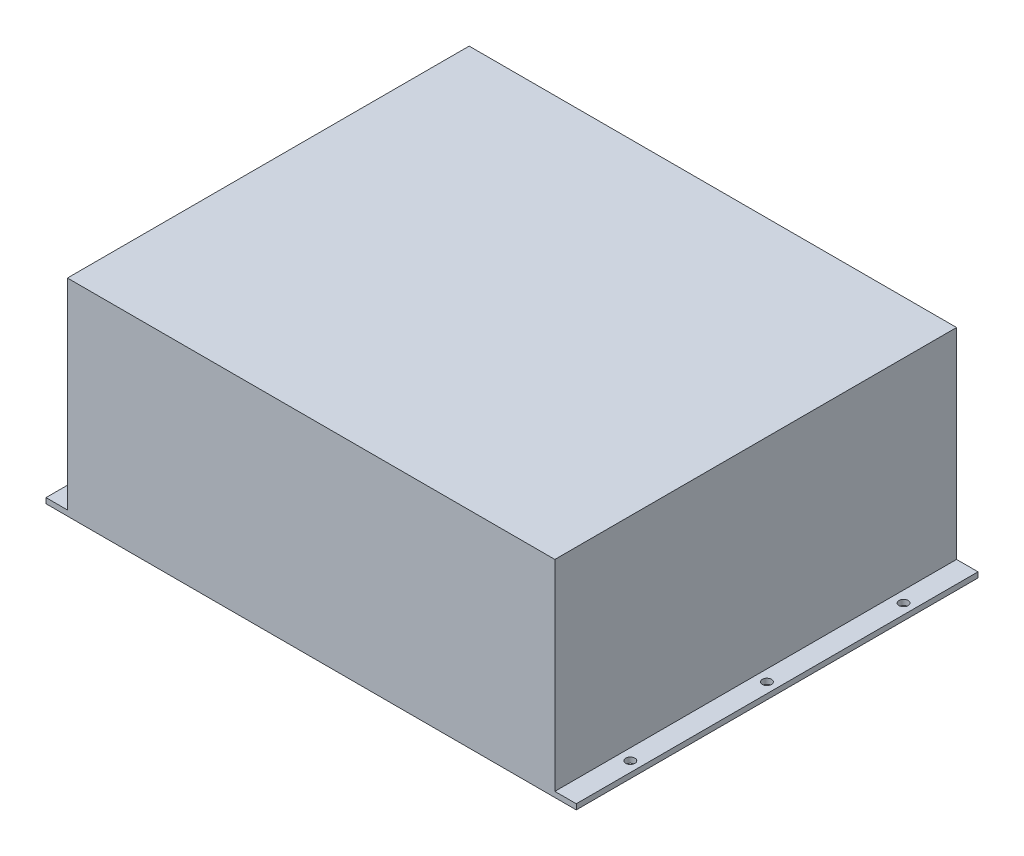
ISO-10303-21;
HEADER;
FILE_DESCRIPTION(('STEP AP214'),'2;1');
FILE_NAME('part.step','',(''),(''),'','','');
FILE_SCHEMA(('AUTOMOTIVE_DESIGN { 1 0 10303 214 1 1 1 1 }'));
ENDSEC;
DATA;
#1=APPLICATION_CONTEXT('core data for automotive mechanical design processes');
#2=APPLICATION_PROTOCOL_DEFINITION('international standard','automotive_design',2000,#1);
#3=PRODUCT_CONTEXT('',#1,'mechanical');
#4=PRODUCT('Part','Part','',(#3));
#5=PRODUCT_RELATED_PRODUCT_CATEGORY('part','',(#4));
#6=PRODUCT_DEFINITION_FORMATION('','',#4);
#7=PRODUCT_DEFINITION_CONTEXT('part definition',#1,'design');
#8=PRODUCT_DEFINITION('design','',#6,#7);
#9=PRODUCT_DEFINITION_SHAPE('','',#8);
#10=(LENGTH_UNIT() NAMED_UNIT(*) SI_UNIT(.MILLI.,.METRE.));
#11=(NAMED_UNIT(*) PLANE_ANGLE_UNIT() SI_UNIT($,.RADIAN.));
#12=(NAMED_UNIT(*) SI_UNIT($,.STERADIAN.) SOLID_ANGLE_UNIT());
#13=UNCERTAINTY_MEASURE_WITH_UNIT(LENGTH_MEASURE(1.E-05),#10,'distance_accuracy_value','');
#14=(GEOMETRIC_REPRESENTATION_CONTEXT(3) GLOBAL_UNCERTAINTY_ASSIGNED_CONTEXT((#13)) GLOBAL_UNIT_ASSIGNED_CONTEXT((#10,
#11,#12)) REPRESENTATION_CONTEXT('',''));
#15=CARTESIAN_POINT('',(0.,0.,0.));
#16=DIRECTION('',(0.,0.,1.));
#17=DIRECTION('',(1.,0.,0.));
#18=AXIS2_PLACEMENT_3D('',#15,#16,#17);
#19=CARTESIAN_POINT('',(91.,77.,75.));
#20=DIRECTION('',(-1.,0.,0.));
#21=DIRECTION('',(0.,0.,1.));
#22=AXIS2_PLACEMENT_3D('',#19,#20,#21);
#23=PLANE('',#22);
#24=DIRECTION('',(0.,0.,1.));
#25=VECTOR('',#24,1.);
#26=CARTESIAN_POINT('',(91.,2.,75.));
#27=LINE('',#26,#25);
#28=CARTESIAN_POINT('',(91.,2.,-75.));
#29=VERTEX_POINT('',#28);
#30=CARTESIAN_POINT('',(91.,2.,75.));
#31=VERTEX_POINT('',#30);
#32=EDGE_CURVE('E49',#29,#31,#27,.T.);
#33=ORIENTED_EDGE('',*,*,#32,.F.);
#34=DIRECTION('',(0.,-1.,0.));
#35=VECTOR('',#34,1.);
#36=CARTESIAN_POINT('',(91.,77.,-75.));
#37=LINE('',#36,#35);
#38=CARTESIAN_POINT('',(91.,77.,-75.));
#39=VERTEX_POINT('',#38);
#40=EDGE_CURVE('E122',#39,#29,#37,.T.);
#41=ORIENTED_EDGE('',*,*,#40,.F.);
#42=DIRECTION('',(0.,0.,-1.));
#43=VECTOR('',#42,1.);
#44=CARTESIAN_POINT('',(91.,77.,75.));
#45=LINE('',#44,#43);
#46=CARTESIAN_POINT('',(91.,77.,75.));
#47=VERTEX_POINT('',#46);
#48=EDGE_CURVE('E168',#47,#39,#45,.T.);
#49=ORIENTED_EDGE('',*,*,#48,.F.);
#50=DIRECTION('',(0.,-1.,0.));
#51=VECTOR('',#50,1.);
#52=CARTESIAN_POINT('',(91.,77.,75.));
#53=LINE('',#52,#51);
#54=EDGE_CURVE('E178',#47,#31,#53,.T.);
#55=ORIENTED_EDGE('',*,*,#54,.T.);
#56=EDGE_LOOP('',(#33,#41,#49,#55));
#57=FACE_BOUND('',#56,.T.);
#58=ADVANCED_FACE('F35',(#57),#23,.F.);
#59=CARTESIAN_POINT('',(-91.,77.,-75.));
#60=DIRECTION('',(0.,0.,1.));
#61=DIRECTION('',(1.,0.,0.));
#62=AXIS2_PLACEMENT_3D('',#59,#60,#61);
#63=PLANE('',#62);
#64=DIRECTION('',(-1.,0.,0.));
#65=VECTOR('',#64,1.);
#66=CARTESIAN_POINT('',(-91.,0.,-75.));
#67=LINE('',#66,#65);
#68=CARTESIAN_POINT('',(99.,0.,-75.));
#69=VERTEX_POINT('',#68);
#70=CARTESIAN_POINT('',(-99.,0.,-75.));
#71=VERTEX_POINT('',#70);
#72=EDGE_CURVE('E165',#69,#71,#67,.T.);
#73=ORIENTED_EDGE('',*,*,#72,.T.);
#74=DIRECTION('',(0.,-1.,0.));
#75=VECTOR('',#74,1.);
#76=CARTESIAN_POINT('',(-99.,2.,-75.));
#77=LINE('',#76,#75);
#78=CARTESIAN_POINT('',(-99.,2.,-75.));
#79=VERTEX_POINT('',#78);
#80=EDGE_CURVE('E162',#79,#71,#77,.T.);
#81=ORIENTED_EDGE('',*,*,#80,.F.);
#82=DIRECTION('',(1.,0.,0.));
#83=VECTOR('',#82,1.);
#84=CARTESIAN_POINT('',(-91.,2.,-75.));
#85=LINE('',#84,#83);
#86=CARTESIAN_POINT('',(-91.,2.,-75.));
#87=VERTEX_POINT('',#86);
#88=EDGE_CURVE('E156',#79,#87,#85,.T.);
#89=ORIENTED_EDGE('',*,*,#88,.T.);
#90=DIRECTION('',(0.,-1.,0.));
#91=VECTOR('',#90,1.);
#92=CARTESIAN_POINT('',(-91.,77.,-75.));
#93=LINE('',#92,#91);
#94=CARTESIAN_POINT('',(-91.,77.,-75.));
#95=VERTEX_POINT('',#94);
#96=EDGE_CURVE('E185',#95,#87,#93,.T.);
#97=ORIENTED_EDGE('',*,*,#96,.F.);
#98=DIRECTION('',(-1.,0.,0.));
#99=VECTOR('',#98,1.);
#100=CARTESIAN_POINT('',(-91.,77.,-75.));
#101=LINE('',#100,#99);
#102=EDGE_CURVE('E171',#39,#95,#101,.T.);
#103=ORIENTED_EDGE('',*,*,#102,.F.);
#104=ORIENTED_EDGE('',*,*,#40,.T.);
#105=DIRECTION('',(-1.,0.,0.));
#106=VECTOR('',#105,1.);
#107=CARTESIAN_POINT('',(91.,2.,-75.));
#108=LINE('',#107,#106);
#109=CARTESIAN_POINT('',(99.,2.,-75.));
#110=VERTEX_POINT('',#109);
#111=EDGE_CURVE('E105',#110,#29,#108,.T.);
#112=ORIENTED_EDGE('',*,*,#111,.F.);
#113=DIRECTION('',(0.,-1.,0.));
#114=VECTOR('',#113,1.);
#115=CARTESIAN_POINT('',(99.,2.,-75.));
#116=LINE('',#115,#114);
#117=EDGE_CURVE('E114',#110,#69,#116,.T.);
#118=ORIENTED_EDGE('',*,*,#117,.T.);
#119=EDGE_LOOP('',(#73,#81,#89,#97,#103,#104,#112,#118));
#120=FACE_BOUND('',#119,.T.);
#121=ADVANCED_FACE('F121',(#120),#63,.F.);
#122=CARTESIAN_POINT('',(-91.,77.,75.));
#123=DIRECTION('',(1.,0.,0.));
#124=DIRECTION('',(0.,0.,-1.));
#125=AXIS2_PLACEMENT_3D('',#122,#123,#124);
#126=PLANE('',#125);
#127=CARTESIAN_POINT('',(-91.,39.5,-10.));
#128=DIRECTION('',(1.,0.,0.));
#129=DIRECTION('',(0.,0.,-1.));
#130=AXIS2_PLACEMENT_3D('',#127,#128,#129);
#131=CIRCLE('',#130,4.00000000000001);
#132=CARTESIAN_POINT('',(-91.,39.5,-14.));
#133=VERTEX_POINT('',#132);
#134=EDGE_CURVE('E11',#133,#133,#131,.F.);
#135=ORIENTED_EDGE('',*,*,#134,.F.);
#136=EDGE_LOOP('',(#135));
#137=FACE_BOUND('',#136,.T.);
#138=CARTESIAN_POINT('',(-91.,39.5,10.));
#139=DIRECTION('',(1.,0.,0.));
#140=DIRECTION('',(0.,0.,-1.));
#141=AXIS2_PLACEMENT_3D('',#138,#139,#140);
#142=CIRCLE('',#141,4.00000000000001);
#143=CARTESIAN_POINT('',(-91.,39.5,5.99999999999999));
#144=VERTEX_POINT('',#143);
#145=EDGE_CURVE('E42',#144,#144,#142,.F.);
#146=ORIENTED_EDGE('',*,*,#145,.F.);
#147=EDGE_LOOP('',(#146));
#148=FACE_BOUND('',#147,.T.);
#149=CARTESIAN_POINT('',(-91.,39.5,0.));
#150=DIRECTION('',(1.,0.,0.));
#151=DIRECTION('',(0.,0.,-1.));
#152=AXIS2_PLACEMENT_3D('',#149,#150,#151);
#153=CIRCLE('',#152,4.);
#154=CARTESIAN_POINT('',(-91.,39.5,-4.));
#155=VERTEX_POINT('',#154);
#156=EDGE_CURVE('E189',#155,#155,#153,.F.);
#157=ORIENTED_EDGE('',*,*,#156,.F.);
#158=EDGE_LOOP('',(#157));
#159=FACE_BOUND('',#158,.T.);
#160=ORIENTED_EDGE('',*,*,#96,.T.);
#161=DIRECTION('',(0.,0.,1.));
#162=VECTOR('',#161,1.);
#163=CARTESIAN_POINT('',(-91.,2.,75.));
#164=LINE('',#163,#162);
#165=CARTESIAN_POINT('',(-91.,2.,75.));
#166=VERTEX_POINT('',#165);
#167=EDGE_CURVE('E150',#87,#166,#164,.T.);
#168=ORIENTED_EDGE('',*,*,#167,.T.);
#169=DIRECTION('',(0.,-1.,0.));
#170=VECTOR('',#169,1.);
#171=CARTESIAN_POINT('',(-91.,77.,75.));
#172=LINE('',#171,#170);
#173=CARTESIAN_POINT('',(-91.,77.,75.));
#174=VERTEX_POINT('',#173);
#175=EDGE_CURVE('E182',#174,#166,#172,.T.);
#176=ORIENTED_EDGE('',*,*,#175,.F.);
#177=DIRECTION('',(0.,0.,1.));
#178=VECTOR('',#177,1.);
#179=CARTESIAN_POINT('',(-91.,77.,75.));
#180=LINE('',#179,#178);
#181=EDGE_CURVE('E174',#95,#174,#180,.T.);
#182=ORIENTED_EDGE('',*,*,#181,.F.);
#183=EDGE_LOOP('',(#160,#168,#176,#182));
#184=FACE_BOUND('',#183,.T.);
#185=ADVANCED_FACE('F196',(#137,#148,#159,#184),#126,.F.);
#186=CARTESIAN_POINT('',(-91.,77.,75.));
#187=DIRECTION('',(0.,0.,-1.));
#188=DIRECTION('',(-1.,0.,0.));
#189=AXIS2_PLACEMENT_3D('',#186,#187,#188);
#190=PLANE('',#189);
#191=DIRECTION('',(1.,0.,0.));
#192=VECTOR('',#191,1.);
#193=CARTESIAN_POINT('',(-91.,0.,75.));
#194=LINE('',#193,#192);
#195=CARTESIAN_POINT('',(-99.,0.,75.));
#196=VERTEX_POINT('',#195);
#197=CARTESIAN_POINT('',(99.,0.,75.));
#198=VERTEX_POINT('',#197);
#199=EDGE_CURVE('E172',#196,#198,#194,.T.);
#200=ORIENTED_EDGE('',*,*,#199,.T.);
#201=DIRECTION('',(0.,-1.,0.));
#202=VECTOR('',#201,1.);
#203=CARTESIAN_POINT('',(99.,2.,75.));
#204=LINE('',#203,#202);
#205=CARTESIAN_POINT('',(99.,2.,75.));
#206=VERTEX_POINT('',#205);
#207=EDGE_CURVE('E119',#206,#198,#204,.T.);
#208=ORIENTED_EDGE('',*,*,#207,.F.);
#209=DIRECTION('',(1.,0.,0.));
#210=VECTOR('',#209,1.);
#211=CARTESIAN_POINT('',(91.,2.,75.));
#212=LINE('',#211,#210);
#213=EDGE_CURVE('E107',#31,#206,#212,.T.);
#214=ORIENTED_EDGE('',*,*,#213,.F.);
#215=ORIENTED_EDGE('',*,*,#54,.F.);
#216=DIRECTION('',(1.,0.,0.));
#217=VECTOR('',#216,1.);
#218=CARTESIAN_POINT('',(-91.,77.,75.));
#219=LINE('',#218,#217);
#220=EDGE_CURVE('E176',#174,#47,#219,.T.);
#221=ORIENTED_EDGE('',*,*,#220,.F.);
#222=ORIENTED_EDGE('',*,*,#175,.T.);
#223=DIRECTION('',(-1.,0.,0.));
#224=VECTOR('',#223,1.);
#225=CARTESIAN_POINT('',(-91.,2.,75.));
#226=LINE('',#225,#224);
#227=CARTESIAN_POINT('',(-99.,2.,75.));
#228=VERTEX_POINT('',#227);
#229=EDGE_CURVE('E57',#166,#228,#226,.T.);
#230=ORIENTED_EDGE('',*,*,#229,.T.);
#231=DIRECTION('',(0.,-1.,0.));
#232=VECTOR('',#231,1.);
#233=CARTESIAN_POINT('',(-99.,2.,75.));
#234=LINE('',#233,#232);
#235=EDGE_CURVE('E159',#228,#196,#234,.T.);
#236=ORIENTED_EDGE('',*,*,#235,.T.);
#237=EDGE_LOOP('',(#200,#208,#214,#215,#221,#222,#230,#236));
#238=FACE_BOUND('',#237,.T.);
#239=ADVANCED_FACE('F199',(#238),#190,.F.);
#240=CARTESIAN_POINT('',(0.,77.,0.));
#241=DIRECTION('',(0.,-1.,0.));
#242=DIRECTION('',(0.,0.,-1.));
#243=AXIS2_PLACEMENT_3D('',#240,#241,#242);
#244=PLANE('',#243);
#245=ORIENTED_EDGE('',*,*,#48,.T.);
#246=ORIENTED_EDGE('',*,*,#102,.T.);
#247=ORIENTED_EDGE('',*,*,#181,.T.);
#248=ORIENTED_EDGE('',*,*,#220,.T.);
#249=EDGE_LOOP('',(#245,#246,#247,#248));
#250=FACE_BOUND('',#249,.T.);
#251=ADVANCED_FACE('F216',(#250),#244,.F.);
#252=CARTESIAN_POINT('',(0.,0.,0.));
#253=DIRECTION('',(0.,-1.,0.));
#254=DIRECTION('',(0.,0.,-1.));
#255=AXIS2_PLACEMENT_3D('',#252,#253,#254);
#256=PLANE('',#255);
#257=CARTESIAN_POINT('',(95.2,0.,-51.));
#258=DIRECTION('',(0.,-1.,0.));
#259=DIRECTION('',(0.,0.,1.));
#260=AXIS2_PLACEMENT_3D('',#257,#258,#259);
#261=CIRCLE('',#260,1.7);
#262=CARTESIAN_POINT('',(95.2,0.,-49.3));
#263=VERTEX_POINT('',#262);
#264=EDGE_CURVE('E129',#263,#263,#261,.T.);
#265=ORIENTED_EDGE('',*,*,#264,.F.);
#266=EDGE_LOOP('',(#265));
#267=FACE_BOUND('',#266,.T.);
#268=CARTESIAN_POINT('',(95.2,0.,51.));
#269=DIRECTION('',(0.,-1.,0.));
#270=DIRECTION('',(0.,0.,-1.));
#271=AXIS2_PLACEMENT_3D('',#268,#269,#270);
#272=CIRCLE('',#271,1.7);
#273=CARTESIAN_POINT('',(95.2,0.,49.3));
#274=VERTEX_POINT('',#273);
#275=EDGE_CURVE('E308',#274,#274,#272,.T.);
#276=ORIENTED_EDGE('',*,*,#275,.F.);
#277=EDGE_LOOP('',(#276));
#278=FACE_BOUND('',#277,.T.);
#279=CARTESIAN_POINT('',(95.2,0.,0.));
#280=DIRECTION('',(0.,-1.,0.));
#281=DIRECTION('',(0.,0.,1.));
#282=AXIS2_PLACEMENT_3D('',#279,#280,#281);
#283=CIRCLE('',#282,1.7);
#284=CARTESIAN_POINT('',(95.2,0.,1.7));
#285=VERTEX_POINT('',#284);
#286=EDGE_CURVE('E314',#285,#285,#283,.T.);
#287=ORIENTED_EDGE('',*,*,#286,.F.);
#288=EDGE_LOOP('',(#287));
#289=FACE_BOUND('',#288,.T.);
#290=CARTESIAN_POINT('',(-95.2,0.,-51.));
#291=DIRECTION('',(0.,1.,0.));
#292=DIRECTION('',(0.,0.,1.));
#293=AXIS2_PLACEMENT_3D('',#290,#291,#292);
#294=CIRCLE('',#293,1.7);
#295=CARTESIAN_POINT('',(-95.2,0.,-49.3));
#296=VERTEX_POINT('',#295);
#297=EDGE_CURVE('E132',#296,#296,#294,.T.);
#298=ORIENTED_EDGE('',*,*,#297,.T.);
#299=EDGE_LOOP('',(#298));
#300=FACE_BOUND('',#299,.T.);
#301=CARTESIAN_POINT('',(-95.2,0.,51.));
#302=DIRECTION('',(0.,1.,0.));
#303=DIRECTION('',(0.,0.,-1.));
#304=AXIS2_PLACEMENT_3D('',#301,#302,#303);
#305=CIRCLE('',#304,1.7);
#306=CARTESIAN_POINT('',(-95.2,0.,49.3));
#307=VERTEX_POINT('',#306);
#308=EDGE_CURVE('E139',#307,#307,#305,.T.);
#309=ORIENTED_EDGE('',*,*,#308,.T.);
#310=EDGE_LOOP('',(#309));
#311=FACE_BOUND('',#310,.T.);
#312=CARTESIAN_POINT('',(-95.2,0.,0.));
#313=DIRECTION('',(0.,1.,0.));
#314=DIRECTION('',(0.,0.,1.));
#315=AXIS2_PLACEMENT_3D('',#312,#313,#314);
#316=CIRCLE('',#315,1.7);
#317=CARTESIAN_POINT('',(-95.2,0.,1.7));
#318=VERTEX_POINT('',#317);
#319=EDGE_CURVE('E145',#318,#318,#316,.T.);
#320=ORIENTED_EDGE('',*,*,#319,.T.);
#321=EDGE_LOOP('',(#320));
#322=FACE_BOUND('',#321,.T.);
#323=ORIENTED_EDGE('',*,*,#72,.F.);
#324=DIRECTION('',(0.,0.,-1.));
#325=VECTOR('',#324,1.);
#326=CARTESIAN_POINT('',(99.,0.,75.));
#327=LINE('',#326,#325);
#328=EDGE_CURVE('E117',#198,#69,#327,.T.);
#329=ORIENTED_EDGE('',*,*,#328,.F.);
#330=ORIENTED_EDGE('',*,*,#199,.F.);
#331=DIRECTION('',(0.,0.,-1.));
#332=VECTOR('',#331,1.);
#333=CARTESIAN_POINT('',(-99.,0.,75.));
#334=LINE('',#333,#332);
#335=EDGE_CURVE('E135',#196,#71,#334,.T.);
#336=ORIENTED_EDGE('',*,*,#335,.T.);
#337=EDGE_LOOP('',(#323,#329,#330,#336));
#338=FACE_BOUND('',#337,.T.);
#339=ADVANCED_FACE('F226',(#267,#278,#289,#300,#311,#322,#338),#256,.T.);
#340=CARTESIAN_POINT('',(-99.,2.,75.));
#341=DIRECTION('',(-1.,0.,0.));
#342=DIRECTION('',(0.,0.,1.));
#343=AXIS2_PLACEMENT_3D('',#340,#341,#342);
#344=PLANE('',#343);
#345=ORIENTED_EDGE('',*,*,#335,.F.);
#346=ORIENTED_EDGE('',*,*,#235,.F.);
#347=DIRECTION('',(0.,0.,-1.));
#348=VECTOR('',#347,1.);
#349=CARTESIAN_POINT('',(-99.,2.,75.));
#350=LINE('',#349,#348);
#351=EDGE_CURVE('E153',#228,#79,#350,.T.);
#352=ORIENTED_EDGE('',*,*,#351,.T.);
#353=ORIENTED_EDGE('',*,*,#80,.T.);
#354=EDGE_LOOP('',(#345,#346,#352,#353));
#355=FACE_BOUND('',#354,.T.);
#356=ADVANCED_FACE('F229',(#355),#344,.T.);
#357=CARTESIAN_POINT('',(0.,2.,0.));
#358=DIRECTION('',(0.,1.,0.));
#359=DIRECTION('',(0.,0.,1.));
#360=AXIS2_PLACEMENT_3D('',#357,#358,#359);
#361=PLANE('',#360);
#362=CARTESIAN_POINT('',(-95.2,2.,-51.));
#363=DIRECTION('',(0.,1.,0.));
#364=DIRECTION('',(0.,0.,1.));
#365=AXIS2_PLACEMENT_3D('',#362,#363,#364);
#366=CIRCLE('',#365,1.7);
#367=CARTESIAN_POINT('',(-95.2,2.,-49.3));
#368=VERTEX_POINT('',#367);
#369=EDGE_CURVE('E136',#368,#368,#366,.T.);
#370=ORIENTED_EDGE('',*,*,#369,.F.);
#371=EDGE_LOOP('',(#370));
#372=FACE_BOUND('',#371,.T.);
#373=CARTESIAN_POINT('',(-95.2,2.,51.));
#374=DIRECTION('',(0.,1.,0.));
#375=DIRECTION('',(0.,0.,-1.));
#376=AXIS2_PLACEMENT_3D('',#373,#374,#375);
#377=CIRCLE('',#376,1.7);
#378=CARTESIAN_POINT('',(-95.2,2.,49.3));
#379=VERTEX_POINT('',#378);
#380=EDGE_CURVE('E142',#379,#379,#377,.T.);
#381=ORIENTED_EDGE('',*,*,#380,.F.);
#382=EDGE_LOOP('',(#381));
#383=FACE_BOUND('',#382,.T.);
#384=CARTESIAN_POINT('',(-95.2,2.,0.));
#385=DIRECTION('',(0.,1.,0.));
#386=DIRECTION('',(0.,0.,1.));
#387=AXIS2_PLACEMENT_3D('',#384,#385,#386);
#388=CIRCLE('',#387,1.7);
#389=CARTESIAN_POINT('',(-95.2,2.,1.7));
#390=VERTEX_POINT('',#389);
#391=EDGE_CURVE('E130',#390,#390,#388,.T.);
#392=ORIENTED_EDGE('',*,*,#391,.F.);
#393=EDGE_LOOP('',(#392));
#394=FACE_BOUND('',#393,.T.);
#395=ORIENTED_EDGE('',*,*,#167,.F.);
#396=ORIENTED_EDGE('',*,*,#88,.F.);
#397=ORIENTED_EDGE('',*,*,#351,.F.);
#398=ORIENTED_EDGE('',*,*,#229,.F.);
#399=EDGE_LOOP('',(#395,#396,#397,#398));
#400=FACE_BOUND('',#399,.T.);
#401=ADVANCED_FACE('F208',(#372,#383,#394,#400),#361,.T.);
#402=CARTESIAN_POINT('',(-95.2,0.,0.));
#403=DIRECTION('',(0.,1.,0.));
#404=DIRECTION('',(0.,0.,1.));
#405=AXIS2_PLACEMENT_3D('',#402,#403,#404);
#406=CYLINDRICAL_SURFACE('',#405,1.7);
#407=ORIENTED_EDGE('',*,*,#319,.F.);
#408=EDGE_LOOP('',(#407));
#409=FACE_BOUND('',#408,.T.);
#410=ORIENTED_EDGE('',*,*,#391,.T.);
#411=EDGE_LOOP('',(#410));
#412=FACE_BOUND('',#411,.T.);
#413=ADVANCED_FACE('F237',(#409,#412),#406,.F.);
#414=CARTESIAN_POINT('',(-95.2,0.,51.));
#415=DIRECTION('',(0.,1.,0.));
#416=DIRECTION('',(0.,0.,1.));
#417=AXIS2_PLACEMENT_3D('',#414,#415,#416);
#418=CYLINDRICAL_SURFACE('',#417,1.7);
#419=ORIENTED_EDGE('',*,*,#308,.F.);
#420=EDGE_LOOP('',(#419));
#421=FACE_BOUND('',#420,.T.);
#422=ORIENTED_EDGE('',*,*,#380,.T.);
#423=EDGE_LOOP('',(#422));
#424=FACE_BOUND('',#423,.T.);
#425=ADVANCED_FACE('F241',(#421,#424),#418,.F.);
#426=CARTESIAN_POINT('',(-95.2,0.,-51.));
#427=DIRECTION('',(0.,1.,0.));
#428=DIRECTION('',(0.,0.,1.));
#429=AXIS2_PLACEMENT_3D('',#426,#427,#428);
#430=CYLINDRICAL_SURFACE('',#429,1.7);
#431=ORIENTED_EDGE('',*,*,#297,.F.);
#432=EDGE_LOOP('',(#431));
#433=FACE_BOUND('',#432,.T.);
#434=ORIENTED_EDGE('',*,*,#369,.T.);
#435=EDGE_LOOP('',(#434));
#436=FACE_BOUND('',#435,.T.);
#437=ADVANCED_FACE('F245',(#433,#436),#430,.F.);
#438=CARTESIAN_POINT('',(99.,2.,75.));
#439=DIRECTION('',(-1.,0.,0.));
#440=DIRECTION('',(0.,0.,1.));
#441=AXIS2_PLACEMENT_3D('',#438,#439,#440);
#442=PLANE('',#441);
#443=ORIENTED_EDGE('',*,*,#328,.T.);
#444=ORIENTED_EDGE('',*,*,#117,.F.);
#445=DIRECTION('',(0.,0.,-1.));
#446=VECTOR('',#445,1.);
#447=CARTESIAN_POINT('',(99.,2.,75.));
#448=LINE('',#447,#446);
#449=EDGE_CURVE('E101',#206,#110,#448,.T.);
#450=ORIENTED_EDGE('',*,*,#449,.F.);
#451=ORIENTED_EDGE('',*,*,#207,.T.);
#452=EDGE_LOOP('',(#443,#444,#450,#451));
#453=FACE_BOUND('',#452,.T.);
#454=ADVANCED_FACE('F115',(#453),#442,.F.);
#455=CARTESIAN_POINT('',(0.,2.,0.));
#456=DIRECTION('',(0.,1.,0.));
#457=DIRECTION('',(0.,0.,1.));
#458=AXIS2_PLACEMENT_3D('',#455,#456,#457);
#459=PLANE('',#458);
#460=CARTESIAN_POINT('',(95.2,2.,-51.));
#461=DIRECTION('',(0.,-1.,0.));
#462=DIRECTION('',(0.,0.,1.));
#463=AXIS2_PLACEMENT_3D('',#460,#461,#462);
#464=CIRCLE('',#463,1.7);
#465=CARTESIAN_POINT('',(95.2,2.,-49.3));
#466=VERTEX_POINT('',#465);
#467=EDGE_CURVE('E305',#466,#466,#464,.T.);
#468=ORIENTED_EDGE('',*,*,#467,.T.);
#469=EDGE_LOOP('',(#468));
#470=FACE_BOUND('',#469,.T.);
#471=CARTESIAN_POINT('',(95.2,2.,51.));
#472=DIRECTION('',(0.,-1.,0.));
#473=DIRECTION('',(0.,0.,-1.));
#474=AXIS2_PLACEMENT_3D('',#471,#472,#473);
#475=CIRCLE('',#474,1.7);
#476=CARTESIAN_POINT('',(95.2,2.,49.3));
#477=VERTEX_POINT('',#476);
#478=EDGE_CURVE('E311',#477,#477,#475,.T.);
#479=ORIENTED_EDGE('',*,*,#478,.T.);
#480=EDGE_LOOP('',(#479));
#481=FACE_BOUND('',#480,.T.);
#482=CARTESIAN_POINT('',(95.2,2.,0.));
#483=DIRECTION('',(0.,-1.,0.));
#484=DIRECTION('',(0.,0.,1.));
#485=AXIS2_PLACEMENT_3D('',#482,#483,#484);
#486=CIRCLE('',#485,1.7);
#487=CARTESIAN_POINT('',(95.2,2.,1.7));
#488=VERTEX_POINT('',#487);
#489=EDGE_CURVE('E302',#488,#488,#486,.T.);
#490=ORIENTED_EDGE('',*,*,#489,.T.);
#491=EDGE_LOOP('',(#490));
#492=FACE_BOUND('',#491,.T.);
#493=ORIENTED_EDGE('',*,*,#32,.T.);
#494=ORIENTED_EDGE('',*,*,#213,.T.);
#495=ORIENTED_EDGE('',*,*,#449,.T.);
#496=ORIENTED_EDGE('',*,*,#111,.T.);
#497=EDGE_LOOP('',(#493,#494,#495,#496));
#498=FACE_BOUND('',#497,.T.);
#499=ADVANCED_FACE('F103',(#470,#481,#492,#498),#459,.T.);
#500=CARTESIAN_POINT('',(95.2,0.,0.));
#501=DIRECTION('',(0.,1.,0.));
#502=DIRECTION('',(0.,0.,1.));
#503=AXIS2_PLACEMENT_3D('',#500,#501,#502);
#504=CYLINDRICAL_SURFACE('',#503,1.7);
#505=ORIENTED_EDGE('',*,*,#286,.T.);
#506=EDGE_LOOP('',(#505));
#507=FACE_BOUND('',#506,.T.);
#508=ORIENTED_EDGE('',*,*,#489,.F.);
#509=EDGE_LOOP('',(#508));
#510=FACE_BOUND('',#509,.T.);
#511=ADVANCED_FACE('F254',(#507,#510),#504,.F.);
#512=CARTESIAN_POINT('',(95.2,0.,51.));
#513=DIRECTION('',(0.,1.,0.));
#514=DIRECTION('',(0.,0.,1.));
#515=AXIS2_PLACEMENT_3D('',#512,#513,#514);
#516=CYLINDRICAL_SURFACE('',#515,1.7);
#517=ORIENTED_EDGE('',*,*,#275,.T.);
#518=EDGE_LOOP('',(#517));
#519=FACE_BOUND('',#518,.T.);
#520=ORIENTED_EDGE('',*,*,#478,.F.);
#521=EDGE_LOOP('',(#520));
#522=FACE_BOUND('',#521,.T.);
#523=ADVANCED_FACE('F258',(#519,#522),#516,.F.);
#524=CARTESIAN_POINT('',(95.2,0.,-51.));
#525=DIRECTION('',(0.,1.,0.));
#526=DIRECTION('',(0.,0.,1.));
#527=AXIS2_PLACEMENT_3D('',#524,#525,#526);
#528=CYLINDRICAL_SURFACE('',#527,1.7);
#529=ORIENTED_EDGE('',*,*,#264,.T.);
#530=EDGE_LOOP('',(#529));
#531=FACE_BOUND('',#530,.T.);
#532=ORIENTED_EDGE('',*,*,#467,.F.);
#533=EDGE_LOOP('',(#532));
#534=FACE_BOUND('',#533,.T.);
#535=ADVANCED_FACE('F262',(#531,#534),#528,.F.);
#536=CARTESIAN_POINT('',(-101.,39.5,0.));
#537=DIRECTION('',(1.,0.,0.));
#538=DIRECTION('',(0.,0.,-1.));
#539=AXIS2_PLACEMENT_3D('',#536,#537,#538);
#540=CYLINDRICAL_SURFACE('',#539,4.);
#541=CARTESIAN_POINT('',(-101.,39.5,0.));
#542=DIRECTION('',(-1.,0.,0.));
#543=DIRECTION('',(0.,0.,1.));
#544=AXIS2_PLACEMENT_3D('',#541,#542,#543);
#545=CIRCLE('',#544,4.);
#546=CARTESIAN_POINT('',(-101.,39.5,4.));
#547=VERTEX_POINT('',#546);
#548=EDGE_CURVE('E297',#547,#547,#545,.T.);
#549=ORIENTED_EDGE('',*,*,#548,.F.);
#550=EDGE_LOOP('',(#549));
#551=FACE_BOUND('',#550,.T.);
#552=ORIENTED_EDGE('',*,*,#156,.T.);
#553=EDGE_LOOP('',(#552));
#554=FACE_BOUND('',#553,.T.);
#555=ADVANCED_FACE('F266',(#551,#554),#540,.T.);
#556=CARTESIAN_POINT('',(-101.,39.5,0.));
#557=DIRECTION('',(-1.,0.,0.));
#558=DIRECTION('',(0.,0.,1.));
#559=AXIS2_PLACEMENT_3D('',#556,#557,#558);
#560=PLANE('',#559);
#561=ORIENTED_EDGE('',*,*,#548,.T.);
#562=EDGE_LOOP('',(#561));
#563=FACE_BOUND('',#562,.T.);
#564=ADVANCED_FACE('F270',(#563),#560,.T.);
#565=CARTESIAN_POINT('',(-101.,39.5,10.));
#566=DIRECTION('',(1.,0.,0.));
#567=DIRECTION('',(0.,0.,-1.));
#568=AXIS2_PLACEMENT_3D('',#565,#566,#567);
#569=CYLINDRICAL_SURFACE('',#568,4.00000000000001);
#570=CARTESIAN_POINT('',(-101.,39.5,10.));
#571=DIRECTION('',(-1.,0.,0.));
#572=DIRECTION('',(0.,0.,1.));
#573=AXIS2_PLACEMENT_3D('',#570,#571,#572);
#574=CIRCLE('',#573,4.00000000000001);
#575=CARTESIAN_POINT('',(-101.,39.5,14.));
#576=VERTEX_POINT('',#575);
#577=EDGE_CURVE('E294',#576,#576,#574,.T.);
#578=ORIENTED_EDGE('',*,*,#577,.F.);
#579=EDGE_LOOP('',(#578));
#580=FACE_BOUND('',#579,.T.);
#581=ORIENTED_EDGE('',*,*,#145,.T.);
#582=EDGE_LOOP('',(#581));
#583=FACE_BOUND('',#582,.T.);
#584=ADVANCED_FACE('F194',(#580,#583),#569,.T.);
#585=CARTESIAN_POINT('',(-101.,39.5,10.));
#586=DIRECTION('',(-1.,0.,0.));
#587=DIRECTION('',(0.,0.,1.));
#588=AXIS2_PLACEMENT_3D('',#585,#586,#587);
#589=PLANE('',#588);
#590=ORIENTED_EDGE('',*,*,#577,.T.);
#591=EDGE_LOOP('',(#590));
#592=FACE_BOUND('',#591,.T.);
#593=ADVANCED_FACE('F277',(#592),#589,.T.);
#594=CARTESIAN_POINT('',(-101.,39.5,-10.));
#595=DIRECTION('',(1.,0.,0.));
#596=DIRECTION('',(0.,0.,-1.));
#597=AXIS2_PLACEMENT_3D('',#594,#595,#596);
#598=CYLINDRICAL_SURFACE('',#597,4.00000000000001);
#599=CARTESIAN_POINT('',(-101.,39.5,-10.));
#600=DIRECTION('',(-1.,0.,0.));
#601=DIRECTION('',(0.,0.,-1.));
#602=AXIS2_PLACEMENT_3D('',#599,#600,#601);
#603=CIRCLE('',#602,4.00000000000001);
#604=CARTESIAN_POINT('',(-101.,39.5,-14.));
#605=VERTEX_POINT('',#604);
#606=EDGE_CURVE('E293',#605,#605,#603,.T.);
#607=ORIENTED_EDGE('',*,*,#606,.F.);
#608=EDGE_LOOP('',(#607));
#609=FACE_BOUND('',#608,.T.);
#610=ORIENTED_EDGE('',*,*,#134,.T.);
#611=EDGE_LOOP('',(#610));
#612=FACE_BOUND('',#611,.T.);
#613=ADVANCED_FACE('F281',(#609,#612),#598,.T.);
#614=CARTESIAN_POINT('',(-101.,39.5,-10.));
#615=DIRECTION('',(1.,0.,0.));
#616=DIRECTION('',(0.,0.,-1.));
#617=AXIS2_PLACEMENT_3D('',#614,#615,#616);
#618=PLANE('',#617);
#619=ORIENTED_EDGE('',*,*,#606,.T.);
#620=EDGE_LOOP('',(#619));
#621=FACE_BOUND('',#620,.T.);
#622=ADVANCED_FACE('F285',(#621),#618,.F.);
#623=CLOSED_SHELL('',(#58,#121,#185,#239,#251,#339,#356,#401,#413,#425,#437,#454,#499,#511,#523,
#535,#555,#564,#584,#593,#613,#622));
#624=MANIFOLD_SOLID_BREP('B2',#623);
#625=ADVANCED_BREP_SHAPE_REPRESENTATION('',(#18,#624),#14);
#626=SHAPE_DEFINITION_REPRESENTATION(#9,#625);
ENDSEC;
END-ISO-10303-21;
